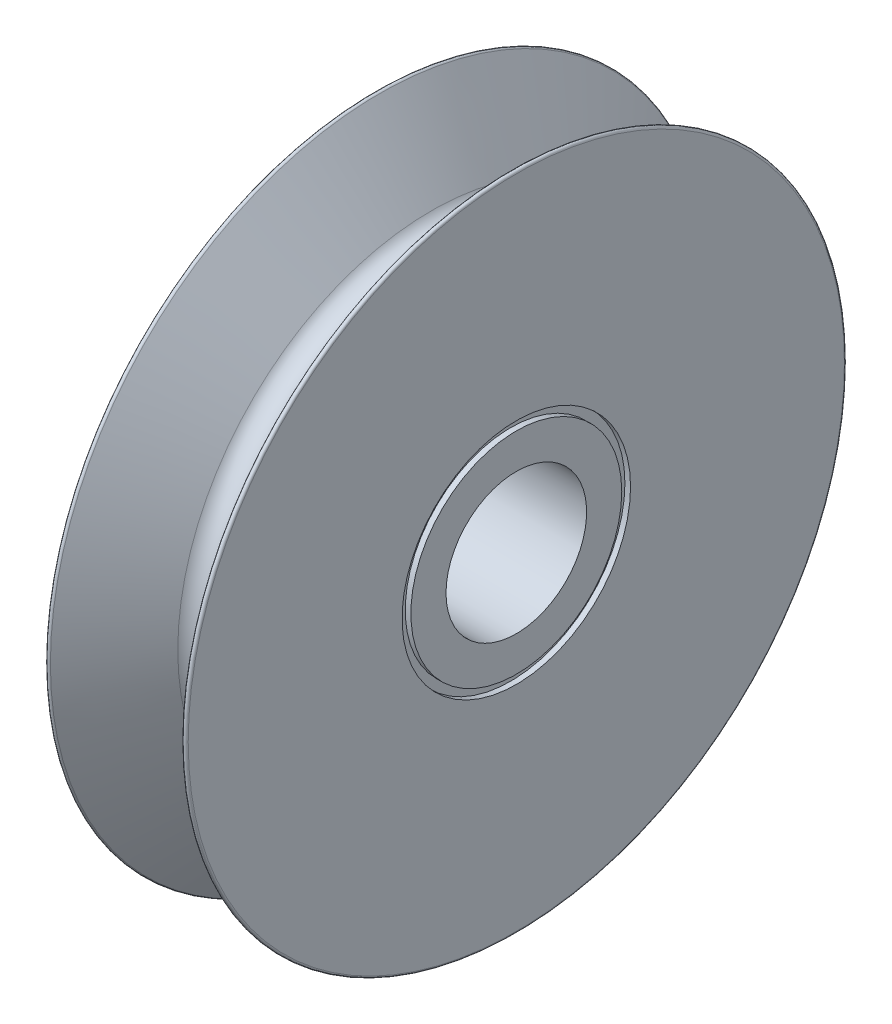
ISO-10303-21;
HEADER;
FILE_DESCRIPTION(('STEP AP214'),'2;1');
FILE_NAME('part.step','',(''),(''),'','','');
FILE_SCHEMA(('AUTOMOTIVE_DESIGN { 1 0 10303 214 1 1 1 1 }'));
ENDSEC;
DATA;
#1=APPLICATION_CONTEXT('core data for automotive mechanical design processes');
#2=APPLICATION_PROTOCOL_DEFINITION('international standard','automotive_design',2000,#1);
#3=PRODUCT_CONTEXT('',#1,'mechanical');
#4=PRODUCT('Part','Part','',(#3));
#5=PRODUCT_RELATED_PRODUCT_CATEGORY('part','',(#4));
#6=PRODUCT_DEFINITION_FORMATION('','',#4);
#7=PRODUCT_DEFINITION_CONTEXT('part definition',#1,'design');
#8=PRODUCT_DEFINITION('design','',#6,#7);
#9=PRODUCT_DEFINITION_SHAPE('','',#8);
#10=(LENGTH_UNIT() NAMED_UNIT(*) SI_UNIT(.MILLI.,.METRE.));
#11=(NAMED_UNIT(*) PLANE_ANGLE_UNIT() SI_UNIT($,.RADIAN.));
#12=(NAMED_UNIT(*) SI_UNIT($,.STERADIAN.) SOLID_ANGLE_UNIT());
#13=UNCERTAINTY_MEASURE_WITH_UNIT(LENGTH_MEASURE(1.E-05),#10,'distance_accuracy_value','');
#14=(GEOMETRIC_REPRESENTATION_CONTEXT(3) GLOBAL_UNCERTAINTY_ASSIGNED_CONTEXT((#13)) GLOBAL_UNIT_ASSIGNED_CONTEXT((#10,
#11,#12)) REPRESENTATION_CONTEXT('',''));
#15=CARTESIAN_POINT('',(0.,0.,0.));
#16=DIRECTION('',(0.,0.,1.));
#17=DIRECTION('',(1.,0.,0.));
#18=AXIS2_PLACEMENT_3D('',#15,#16,#17);
#19=CARTESIAN_POINT('',(0.,14.8166666666667,0.));
#20=DIRECTION('',(1.,0.,0.));
#21=DIRECTION('',(0.,0.,-1.));
#22=AXIS2_PLACEMENT_3D('',#19,#20,#21);
#23=PLANE('',#22);
#24=CARTESIAN_POINT('',(0.,0.,0.));
#25=DIRECTION('',(-1.,0.,0.));
#26=DIRECTION('',(0.,0.,1.));
#27=AXIS2_PLACEMENT_3D('',#24,#25,#26);
#28=CIRCLE('',#27,3.175);
#29=CARTESIAN_POINT('',(0.,0.,3.175));
#30=VERTEX_POINT('',#29);
#31=EDGE_CURVE('E10',#30,#30,#28,.T.);
#32=ORIENTED_EDGE('',*,*,#31,.F.);
#33=EDGE_LOOP('',(#32));
#34=FACE_BOUND('',#33,.T.);
#35=CARTESIAN_POINT('',(0.,0.,0.));
#36=DIRECTION('',(-1.,0.,0.));
#37=DIRECTION('',(0.,0.,1.));
#38=AXIS2_PLACEMENT_3D('',#35,#36,#37);
#39=CIRCLE('',#38,4.7625);
#40=CARTESIAN_POINT('',(0.,0.,4.7625));
#41=VERTEX_POINT('',#40);
#42=EDGE_CURVE('E84',#41,#41,#39,.T.);
#43=ORIENTED_EDGE('',*,*,#42,.T.);
#44=EDGE_LOOP('',(#43));
#45=FACE_BOUND('',#44,.T.);
#46=ADVANCED_FACE('F33',(#34,#45),#23,.F.);
#47=CARTESIAN_POINT('',(6.35,3.175,0.));
#48=DIRECTION('',(-1.,0.,0.));
#49=DIRECTION('',(0.,0.,1.));
#50=AXIS2_PLACEMENT_3D('',#47,#48,#49);
#51=PLANE('',#50);
#52=CARTESIAN_POINT('',(6.35,0.,0.));
#53=DIRECTION('',(-1.,0.,0.));
#54=DIRECTION('',(0.,0.,1.));
#55=AXIS2_PLACEMENT_3D('',#52,#53,#54);
#56=CIRCLE('',#55,3.175);
#57=CARTESIAN_POINT('',(6.35,0.,3.175));
#58=VERTEX_POINT('',#57);
#59=EDGE_CURVE('E40',#58,#58,#56,.T.);
#60=ORIENTED_EDGE('',*,*,#59,.T.);
#61=EDGE_LOOP('',(#60));
#62=FACE_BOUND('',#61,.T.);
#63=CARTESIAN_POINT('',(6.35,0.,0.));
#64=DIRECTION('',(1.,0.,0.));
#65=DIRECTION('',(0.,0.,-1.));
#66=AXIS2_PLACEMENT_3D('',#63,#64,#65);
#67=CIRCLE('',#66,4.7625);
#68=CARTESIAN_POINT('',(6.35,0.,-4.7625));
#69=VERTEX_POINT('',#68);
#70=EDGE_CURVE('E72',#69,#69,#67,.T.);
#71=ORIENTED_EDGE('',*,*,#70,.T.);
#72=EDGE_LOOP('',(#71));
#73=FACE_BOUND('',#72,.T.);
#74=ADVANCED_FACE('F109',(#62,#73),#51,.F.);
#75=CARTESIAN_POINT('',(0.,0.,0.));
#76=DIRECTION('',(-1.,0.,0.));
#77=DIRECTION('',(0.,0.,1.));
#78=AXIS2_PLACEMENT_3D('',#75,#76,#77);
#79=CIRCLE('',#78,5.159375);
#80=CARTESIAN_POINT('',(0.,0.,5.159375));
#81=VERTEX_POINT('',#80);
#82=EDGE_CURVE('E78',#81,#81,#79,.T.);
#83=ORIENTED_EDGE('',*,*,#82,.F.);
#84=EDGE_LOOP('',(#83));
#85=FACE_BOUND('',#84,.T.);
#86=CARTESIAN_POINT('',(0.,0.,0.));
#87=DIRECTION('',(-1.,0.,0.));
#88=DIRECTION('',(0.,0.,1.));
#89=AXIS2_PLACEMENT_3D('',#86,#87,#88);
#90=CIRCLE('',#89,14.8166666666667);
#91=CARTESIAN_POINT('',(0.,0.,14.8166666666667));
#92=VERTEX_POINT('',#91);
#93=EDGE_CURVE('E62',#92,#92,#90,.T.);
#94=ORIENTED_EDGE('',*,*,#93,.T.);
#95=EDGE_LOOP('',(#94));
#96=FACE_BOUND('',#95,.T.);
#97=ADVANCED_FACE('F35',(#85,#96),#23,.F.);
#98=CARTESIAN_POINT('',(0.,0.,0.));
#99=DIRECTION('',(-1.,0.,0.));
#100=DIRECTION('',(0.,0.,1.));
#101=AXIS2_PLACEMENT_3D('',#98,#99,#100);
#102=CYLINDRICAL_SURFACE('',#101,3.175);
#103=ORIENTED_EDGE('',*,*,#59,.F.);
#104=EDGE_LOOP('',(#103));
#105=FACE_BOUND('',#104,.T.);
#106=ORIENTED_EDGE('',*,*,#31,.T.);
#107=EDGE_LOOP('',(#106));
#108=FACE_BOUND('',#107,.T.);
#109=ADVANCED_FACE('F108',(#105,#108),#102,.F.);
#110=CARTESIAN_POINT('',(6.35,0.,0.));
#111=DIRECTION('',(1.,0.,0.));
#112=DIRECTION('',(0.,0.,-1.));
#113=AXIS2_PLACEMENT_3D('',#110,#111,#112);
#114=CIRCLE('',#113,5.159375);
#115=CARTESIAN_POINT('',(6.35,0.,-5.159375));
#116=VERTEX_POINT('',#115);
#117=EDGE_CURVE('E66',#116,#116,#114,.T.);
#118=ORIENTED_EDGE('',*,*,#117,.F.);
#119=EDGE_LOOP('',(#118));
#120=FACE_BOUND('',#119,.T.);
#121=CARTESIAN_POINT('',(6.35,0.,0.));
#122=DIRECTION('',(-1.,0.,0.));
#123=DIRECTION('',(0.,0.,1.));
#124=AXIS2_PLACEMENT_3D('',#121,#122,#123);
#125=CIRCLE('',#124,14.8166666666667);
#126=CARTESIAN_POINT('',(6.35,0.,14.8166666666667));
#127=VERTEX_POINT('',#126);
#128=EDGE_CURVE('E44',#127,#127,#125,.T.);
#129=ORIENTED_EDGE('',*,*,#128,.F.);
#130=EDGE_LOOP('',(#129));
#131=FACE_BOUND('',#130,.T.);
#132=ADVANCED_FACE('F140',(#120,#131),#51,.F.);
#133=CARTESIAN_POINT('',(6.25,0.,0.));
#134=DIRECTION('',(-1.,0.,0.));
#135=DIRECTION('',(0.,0.,1.));
#136=AXIS2_PLACEMENT_3D('',#133,#134,#135);
#137=TOROIDAL_SURFACE('',#136,14.8166666666667,0.1);
#138=CARTESIAN_POINT('',(6.16747752097375,0.,0.));
#139=DIRECTION('',(-1.,0.,0.));
#140=DIRECTION('',(0.,0.,1.));
#141=AXIS2_PLACEMENT_3D('',#138,#139,#140);
#142=CIRCLE('',#141,14.8731471097896);
#143=CARTESIAN_POINT('',(6.16747752097375,0.,14.8731471097896));
#144=VERTEX_POINT('',#143);
#145=EDGE_CURVE('E48',#144,#144,#142,.T.);
#146=ORIENTED_EDGE('',*,*,#145,.F.);
#147=EDGE_LOOP('',(#146));
#148=FACE_BOUND('',#147,.T.);
#149=ORIENTED_EDGE('',*,*,#128,.T.);
#150=EDGE_LOOP('',(#149));
#151=FACE_BOUND('',#150,.T.);
#152=ADVANCED_FACE('F134',(#148,#151),#137,.T.);
#153=CARTESIAN_POINT('',(6.16747752097375,0.,0.));
#154=DIRECTION('',(1.,0.,0.));
#155=DIRECTION('',(0.,0.,-1.));
#156=AXIS2_PLACEMENT_3D('',#153,#154,#155);
#157=CONICAL_SURFACE('',#156,14.8731471097896,0.970600080921954);
#158=CARTESIAN_POINT('',(3.83002217727082,0.,0.));
#159=DIRECTION('',(-1.,0.,0.));
#160=DIRECTION('',(0.,0.,1.));
#161=AXIS2_PLACEMENT_3D('',#158,#159,#160);
#162=CIRCLE('',#161,11.4579364827117);
#163=CARTESIAN_POINT('',(3.83002217727082,0.,11.4579364827117));
#164=VERTEX_POINT('',#163);
#165=EDGE_CURVE('E53',#164,#164,#162,.T.);
#166=ORIENTED_EDGE('',*,*,#165,.F.);
#167=EDGE_LOOP('',(#166));
#168=FACE_BOUND('',#167,.T.);
#169=ORIENTED_EDGE('',*,*,#145,.T.);
#170=EDGE_LOOP('',(#169));
#171=FACE_BOUND('',#170,.T.);
#172=ADVANCED_FACE('F128',(#168,#171),#157,.T.);
#173=CARTESIAN_POINT('',(3.175,0.,0.));
#174=DIRECTION('',(-1.,0.,0.));
#175=DIRECTION('',(0.,0.,1.));
#176=AXIS2_PLACEMENT_3D('',#173,#174,#175);
#177=TOROIDAL_SURFACE('',#176,11.90625,0.79375);
#178=CARTESIAN_POINT('',(2.51997782272918,0.,0.));
#179=DIRECTION('',(-1.,0.,0.));
#180=DIRECTION('',(0.,0.,1.));
#181=AXIS2_PLACEMENT_3D('',#178,#179,#180);
#182=CIRCLE('',#181,11.4579364827117);
#183=CARTESIAN_POINT('',(2.51997782272918,0.,11.4579364827117));
#184=VERTEX_POINT('',#183);
#185=EDGE_CURVE('E56',#184,#184,#182,.T.);
#186=ORIENTED_EDGE('',*,*,#185,.F.);
#187=EDGE_LOOP('',(#186));
#188=FACE_BOUND('',#187,.T.);
#189=ORIENTED_EDGE('',*,*,#165,.T.);
#190=EDGE_LOOP('',(#189));
#191=FACE_BOUND('',#190,.T.);
#192=ADVANCED_FACE('F122',(#188,#191),#177,.F.);
#193=CARTESIAN_POINT('',(2.51997782272918,0.,0.));
#194=DIRECTION('',(-1.,0.,0.));
#195=DIRECTION('',(0.,0.,1.));
#196=AXIS2_PLACEMENT_3D('',#193,#194,#195);
#197=CONICAL_SURFACE('',#196,11.4579364827117,0.970600080921954);
#198=CARTESIAN_POINT('',(0.182522479026245,0.,0.));
#199=DIRECTION('',(-1.,0.,0.));
#200=DIRECTION('',(0.,0.,1.));
#201=AXIS2_PLACEMENT_3D('',#198,#199,#200);
#202=CIRCLE('',#201,14.8731471097896);
#203=CARTESIAN_POINT('',(0.182522479026245,0.,14.8731471097896));
#204=VERTEX_POINT('',#203);
#205=EDGE_CURVE('E59',#204,#204,#202,.T.);
#206=ORIENTED_EDGE('',*,*,#205,.F.);
#207=EDGE_LOOP('',(#206));
#208=FACE_BOUND('',#207,.T.);
#209=ORIENTED_EDGE('',*,*,#185,.T.);
#210=EDGE_LOOP('',(#209));
#211=FACE_BOUND('',#210,.T.);
#212=ADVANCED_FACE('F116',(#208,#211),#197,.T.);
#213=CARTESIAN_POINT('',(0.099999999999998,0.,0.));
#214=DIRECTION('',(-1.,0.,0.));
#215=DIRECTION('',(0.,0.,1.));
#216=AXIS2_PLACEMENT_3D('',#213,#214,#215);
#217=TOROIDAL_SURFACE('',#216,14.8166666666667,0.100000000000001);
#218=ORIENTED_EDGE('',*,*,#93,.F.);
#219=EDGE_LOOP('',(#218));
#220=FACE_BOUND('',#219,.T.);
#221=ORIENTED_EDGE('',*,*,#205,.T.);
#222=EDGE_LOOP('',(#221));
#223=FACE_BOUND('',#222,.T.);
#224=ADVANCED_FACE('F112',(#220,#223),#217,.T.);
#225=CARTESIAN_POINT('',(6.096,0.,0.));
#226=DIRECTION('',(1.,0.,0.));
#227=DIRECTION('',(0.,0.,-1.));
#228=AXIS2_PLACEMENT_3D('',#225,#226,#227);
#229=CYLINDRICAL_SURFACE('',#228,5.159375);
#230=CARTESIAN_POINT('',(6.096,0.,0.));
#231=DIRECTION('',(1.,0.,0.));
#232=DIRECTION('',(0.,0.,-1.));
#233=AXIS2_PLACEMENT_3D('',#230,#231,#232);
#234=CIRCLE('',#233,5.159375);
#235=CARTESIAN_POINT('',(6.096,0.,-5.159375));
#236=VERTEX_POINT('',#235);
#237=EDGE_CURVE('E65',#236,#236,#234,.T.);
#238=ORIENTED_EDGE('',*,*,#237,.F.);
#239=EDGE_LOOP('',(#238));
#240=FACE_BOUND('',#239,.T.);
#241=ORIENTED_EDGE('',*,*,#117,.T.);
#242=EDGE_LOOP('',(#241));
#243=FACE_BOUND('',#242,.T.);
#244=ADVANCED_FACE('F115',(#240,#243),#229,.F.);
#245=CARTESIAN_POINT('',(6.096,0.,0.));
#246=DIRECTION('',(1.,0.,0.));
#247=DIRECTION('',(0.,0.,-1.));
#248=AXIS2_PLACEMENT_3D('',#245,#246,#247);
#249=PLANE('',#248);
#250=CARTESIAN_POINT('',(6.096,0.,0.));
#251=DIRECTION('',(1.,0.,0.));
#252=DIRECTION('',(0.,0.,-1.));
#253=AXIS2_PLACEMENT_3D('',#250,#251,#252);
#254=CIRCLE('',#253,4.7625);
#255=CARTESIAN_POINT('',(6.096,0.,-4.7625));
#256=VERTEX_POINT('',#255);
#257=EDGE_CURVE('E69',#256,#256,#254,.T.);
#258=ORIENTED_EDGE('',*,*,#257,.F.);
#259=EDGE_LOOP('',(#258));
#260=FACE_BOUND('',#259,.T.);
#261=ORIENTED_EDGE('',*,*,#237,.T.);
#262=EDGE_LOOP('',(#261));
#263=FACE_BOUND('',#262,.T.);
#264=ADVANCED_FACE('F166',(#260,#263),#249,.T.);
#265=CARTESIAN_POINT('',(6.096,0.,0.));
#266=DIRECTION('',(1.,0.,0.));
#267=DIRECTION('',(0.,0.,-1.));
#268=AXIS2_PLACEMENT_3D('',#265,#266,#267);
#269=CYLINDRICAL_SURFACE('',#268,4.7625);
#270=ORIENTED_EDGE('',*,*,#257,.T.);
#271=EDGE_LOOP('',(#270));
#272=FACE_BOUND('',#271,.T.);
#273=ORIENTED_EDGE('',*,*,#70,.F.);
#274=EDGE_LOOP('',(#273));
#275=FACE_BOUND('',#274,.T.);
#276=ADVANCED_FACE('F102',(#272,#275),#269,.T.);
#277=CARTESIAN_POINT('',(0.254,0.,0.));
#278=DIRECTION('',(-1.,0.,0.));
#279=DIRECTION('',(0.,0.,1.));
#280=AXIS2_PLACEMENT_3D('',#277,#278,#279);
#281=CYLINDRICAL_SURFACE('',#280,5.159375);
#282=CARTESIAN_POINT('',(0.254,0.,0.));
#283=DIRECTION('',(-1.,0.,0.));
#284=DIRECTION('',(0.,0.,1.));
#285=AXIS2_PLACEMENT_3D('',#282,#283,#284);
#286=CIRCLE('',#285,5.159375);
#287=CARTESIAN_POINT('',(0.254,0.,5.159375));
#288=VERTEX_POINT('',#287);
#289=EDGE_CURVE('E75',#288,#288,#286,.T.);
#290=ORIENTED_EDGE('',*,*,#289,.F.);
#291=EDGE_LOOP('',(#290));
#292=FACE_BOUND('',#291,.T.);
#293=ORIENTED_EDGE('',*,*,#82,.T.);
#294=EDGE_LOOP('',(#293));
#295=FACE_BOUND('',#294,.T.);
#296=ADVANCED_FACE('F96',(#292,#295),#281,.F.);
#297=CARTESIAN_POINT('',(0.254,0.,0.));
#298=DIRECTION('',(-1.,0.,0.));
#299=DIRECTION('',(0.,0.,1.));
#300=AXIS2_PLACEMENT_3D('',#297,#298,#299);
#301=PLANE('',#300);
#302=CARTESIAN_POINT('',(0.254,0.,0.));
#303=DIRECTION('',(-1.,0.,0.));
#304=DIRECTION('',(0.,0.,1.));
#305=AXIS2_PLACEMENT_3D('',#302,#303,#304);
#306=CIRCLE('',#305,4.7625);
#307=CARTESIAN_POINT('',(0.254,0.,4.7625));
#308=VERTEX_POINT('',#307);
#309=EDGE_CURVE('E81',#308,#308,#306,.T.);
#310=ORIENTED_EDGE('',*,*,#309,.F.);
#311=EDGE_LOOP('',(#310));
#312=FACE_BOUND('',#311,.T.);
#313=ORIENTED_EDGE('',*,*,#289,.T.);
#314=EDGE_LOOP('',(#313));
#315=FACE_BOUND('',#314,.T.);
#316=ADVANCED_FACE('F93',(#312,#315),#301,.T.);
#317=CARTESIAN_POINT('',(0.254,0.,0.));
#318=DIRECTION('',(-1.,0.,0.));
#319=DIRECTION('',(0.,0.,1.));
#320=AXIS2_PLACEMENT_3D('',#317,#318,#319);
#321=CYLINDRICAL_SURFACE('',#320,4.7625);
#322=ORIENTED_EDGE('',*,*,#309,.T.);
#323=EDGE_LOOP('',(#322));
#324=FACE_BOUND('',#323,.T.);
#325=ORIENTED_EDGE('',*,*,#42,.F.);
#326=EDGE_LOOP('',(#325));
#327=FACE_BOUND('',#326,.T.);
#328=ADVANCED_FACE('F90',(#324,#327),#321,.T.);
#329=CLOSED_SHELL('',(#46,#74,#97,#109,#132,#152,#172,#192,#212,#224,#244,#264,#276,#296,#316,#328));
#330=MANIFOLD_SOLID_BREP('B2',#329);
#331=ADVANCED_BREP_SHAPE_REPRESENTATION('',(#18,#330),#14);
#332=SHAPE_DEFINITION_REPRESENTATION(#9,#331);
ENDSEC;
END-ISO-10303-21;
